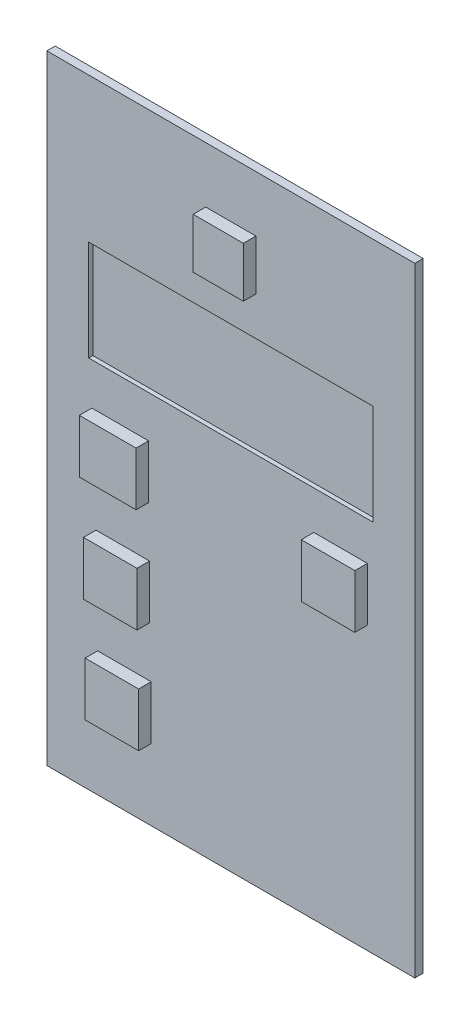
ISO-10303-21;
HEADER;
FILE_DESCRIPTION(('STEP AP214'),'2;1');
FILE_NAME('part.step','',(''),(''),'','','');
FILE_SCHEMA(('AUTOMOTIVE_DESIGN { 1 0 10303 214 1 1 1 1 }'));
ENDSEC;
DATA;
#1=APPLICATION_CONTEXT('core data for automotive mechanical design processes');
#2=APPLICATION_PROTOCOL_DEFINITION('international standard','automotive_design',2000,#1);
#3=PRODUCT_CONTEXT('',#1,'mechanical');
#4=PRODUCT('Part','Part','',(#3));
#5=PRODUCT_RELATED_PRODUCT_CATEGORY('part','',(#4));
#6=PRODUCT_DEFINITION_FORMATION('','',#4);
#7=PRODUCT_DEFINITION_CONTEXT('part definition',#1,'design');
#8=PRODUCT_DEFINITION('design','',#6,#7);
#9=PRODUCT_DEFINITION_SHAPE('','',#8);
#10=(LENGTH_UNIT() NAMED_UNIT(*) SI_UNIT(.MILLI.,.METRE.));
#11=(NAMED_UNIT(*) PLANE_ANGLE_UNIT() SI_UNIT($,.RADIAN.));
#12=(NAMED_UNIT(*) SI_UNIT($,.STERADIAN.) SOLID_ANGLE_UNIT());
#13=UNCERTAINTY_MEASURE_WITH_UNIT(LENGTH_MEASURE(1.E-05),#10,'distance_accuracy_value','');
#14=(GEOMETRIC_REPRESENTATION_CONTEXT(3) GLOBAL_UNCERTAINTY_ASSIGNED_CONTEXT((#13)) GLOBAL_UNIT_ASSIGNED_CONTEXT((#10,
#11,#12)) REPRESENTATION_CONTEXT('',''));
#15=CARTESIAN_POINT('',(0.,0.,0.));
#16=DIRECTION('',(0.,0.,1.));
#17=DIRECTION('',(1.,0.,0.));
#18=AXIS2_PLACEMENT_3D('',#15,#16,#17);
#19=CARTESIAN_POINT('',(0.,0.,1.));
#20=DIRECTION('',(0.,0.,-1.));
#21=DIRECTION('',(-1.,0.,0.));
#22=AXIS2_PLACEMENT_3D('',#19,#20,#21);
#23=PLANE('',#22);
#24=DIRECTION('',(0.,-1.,0.));
#25=VECTOR('',#24,1.);
#26=CARTESIAN_POINT('',(6.07990921444725,14.9147937996406,1.));
#27=LINE('',#26,#25);
#28=CARTESIAN_POINT('',(6.07990921444725,14.9147937996406,1.));
#29=VERTEX_POINT('',#28);
#30=CARTESIAN_POINT('',(6.07990921444725,8.51479379964056,1.));
#31=VERTEX_POINT('',#30);
#32=EDGE_CURVE('E251',#29,#31,#27,.T.);
#33=ORIENTED_EDGE('',*,*,#32,.F.);
#34=DIRECTION('',(-1.,0.,0.));
#35=VECTOR('',#34,1.);
#36=CARTESIAN_POINT('',(6.07990921444725,14.9147937996406,1.));
#37=LINE('',#36,#35);
#38=CARTESIAN_POINT('',(12.4799092144472,14.9147937996406,1.));
#39=VERTEX_POINT('',#38);
#40=EDGE_CURVE('E267',#39,#29,#37,.T.);
#41=ORIENTED_EDGE('',*,*,#40,.F.);
#42=DIRECTION('',(0.,1.,0.));
#43=VECTOR('',#42,1.);
#44=CARTESIAN_POINT('',(12.4799092144472,14.9147937996406,1.));
#45=LINE('',#44,#43);
#46=CARTESIAN_POINT('',(12.4799092144472,8.51479379964056,1.));
#47=VERTEX_POINT('',#46);
#48=EDGE_CURVE('E280',#47,#39,#45,.T.);
#49=ORIENTED_EDGE('',*,*,#48,.F.);
#50=DIRECTION('',(1.,0.,0.));
#51=VECTOR('',#50,1.);
#52=CARTESIAN_POINT('',(6.07990921444725,8.51479379964056,1.));
#53=LINE('',#52,#51);
#54=EDGE_CURVE('E256',#31,#47,#53,.T.);
#55=ORIENTED_EDGE('',*,*,#54,.F.);
#56=EDGE_LOOP('',(#33,#41,#49,#55));
#57=FACE_BOUND('',#56,.T.);
#58=DIRECTION('',(0.,-1.,0.));
#59=VECTOR('',#58,1.);
#60=CARTESIAN_POINT('',(5.39200405704682,39.7024845469302,1.));
#61=LINE('',#60,#59);
#62=CARTESIAN_POINT('',(5.39200405704682,39.7024845469302,1.));
#63=VERTEX_POINT('',#62);
#64=CARTESIAN_POINT('',(5.39200405704682,33.3147937996406,1.));
#65=VERTEX_POINT('',#64);
#66=EDGE_CURVE('E347',#63,#65,#61,.T.);
#67=ORIENTED_EDGE('',*,*,#66,.F.);
#68=DIRECTION('',(-1.,0.,0.));
#69=VECTOR('',#68,1.);
#70=CARTESIAN_POINT('',(5.39200405704682,39.7024845469302,1.));
#71=LINE('',#70,#69);
#72=CARTESIAN_POINT('',(12.1727834657082,39.7024845469302,1.));
#73=VERTEX_POINT('',#72);
#74=EDGE_CURVE('E353',#73,#63,#71,.T.);
#75=ORIENTED_EDGE('',*,*,#74,.F.);
#76=DIRECTION('',(0.,1.,0.));
#77=VECTOR('',#76,1.);
#78=CARTESIAN_POINT('',(12.1727834657082,39.7024845469302,1.));
#79=LINE('',#78,#77);
#80=CARTESIAN_POINT('',(12.1727834657082,33.3147937996406,1.));
#81=VERTEX_POINT('',#80);
#82=EDGE_CURVE('E370',#81,#73,#79,.T.);
#83=ORIENTED_EDGE('',*,*,#82,.F.);
#84=DIRECTION('',(1.,0.,0.));
#85=VECTOR('',#84,1.);
#86=CARTESIAN_POINT('',(5.39200405704682,33.3147937996406,1.));
#87=LINE('',#86,#85);
#88=EDGE_CURVE('E366',#65,#81,#87,.T.);
#89=ORIENTED_EDGE('',*,*,#88,.F.);
#90=EDGE_LOOP('',(#67,#75,#83,#89));
#91=FACE_BOUND('',#90,.T.);
#92=DIRECTION('',(0.,-1.,0.));
#93=VECTOR('',#92,1.);
#94=CARTESIAN_POINT('',(0.,0.,1.));
#95=LINE('',#94,#93);
#96=CARTESIAN_POINT('',(0.,74.,1.));
#97=VERTEX_POINT('',#96);
#98=CARTESIAN_POINT('',(0.,0.,1.));
#99=VERTEX_POINT('',#98);
#100=EDGE_CURVE('E482',#97,#99,#95,.T.);
#101=ORIENTED_EDGE('',*,*,#100,.T.);
#102=DIRECTION('',(1.,0.,0.));
#103=VECTOR('',#102,1.);
#104=CARTESIAN_POINT('',(0.,0.,1.));
#105=LINE('',#104,#103);
#106=CARTESIAN_POINT('',(44.,0.,1.));
#107=VERTEX_POINT('',#106);
#108=EDGE_CURVE('E486',#99,#107,#105,.T.);
#109=ORIENTED_EDGE('',*,*,#108,.T.);
#110=DIRECTION('',(0.,1.,0.));
#111=VECTOR('',#110,1.);
#112=CARTESIAN_POINT('',(44.,0.,1.));
#113=LINE('',#112,#111);
#114=CARTESIAN_POINT('',(44.,74.,1.));
#115=VERTEX_POINT('',#114);
#116=EDGE_CURVE('E490',#107,#115,#113,.T.);
#117=ORIENTED_EDGE('',*,*,#116,.T.);
#118=DIRECTION('',(-1.,0.,0.));
#119=VECTOR('',#118,1.);
#120=CARTESIAN_POINT('',(0.,74.,1.));
#121=LINE('',#120,#119);
#122=EDGE_CURVE('E493',#115,#97,#121,.T.);
#123=ORIENTED_EDGE('',*,*,#122,.T.);
#124=EDGE_LOOP('',(#101,#109,#117,#123));
#125=FACE_BOUND('',#124,.T.);
#126=DIRECTION('',(1.,0.,0.));
#127=VECTOR('',#126,1.);
#128=CARTESIAN_POINT('',(5.,44.7035691512551,1.));
#129=LINE('',#128,#127);
#130=CARTESIAN_POINT('',(5.,44.7035691512551,1.));
#131=VERTEX_POINT('',#130);
#132=CARTESIAN_POINT('',(39.,44.7035691512551,1.));
#133=VERTEX_POINT('',#132);
#134=EDGE_CURVE('E458',#131,#133,#129,.T.);
#135=ORIENTED_EDGE('',*,*,#134,.F.);
#136=DIRECTION('',(0.,-1.,0.));
#137=VECTOR('',#136,1.);
#138=CARTESIAN_POINT('',(5.,56.7035691512551,1.));
#139=LINE('',#138,#137);
#140=CARTESIAN_POINT('',(5.,56.7035691512551,1.));
#141=VERTEX_POINT('',#140);
#142=EDGE_CURVE('E437',#141,#131,#139,.T.);
#143=ORIENTED_EDGE('',*,*,#142,.F.);
#144=DIRECTION('',(-1.,0.,0.));
#145=VECTOR('',#144,1.);
#146=CARTESIAN_POINT('',(5.,56.7035691512551,1.));
#147=LINE('',#146,#145);
#148=CARTESIAN_POINT('',(39.,56.7035691512551,1.));
#149=VERTEX_POINT('',#148);
#150=EDGE_CURVE('E443',#149,#141,#147,.T.);
#151=ORIENTED_EDGE('',*,*,#150,.F.);
#152=DIRECTION('',(0.,1.,0.));
#153=VECTOR('',#152,1.);
#154=CARTESIAN_POINT('',(39.,56.7035691512551,1.));
#155=LINE('',#154,#153);
#156=EDGE_CURVE('E462',#133,#149,#155,.T.);
#157=ORIENTED_EDGE('',*,*,#156,.F.);
#158=EDGE_LOOP('',(#135,#143,#151,#157));
#159=FACE_BOUND('',#158,.T.);
#160=DIRECTION('',(0.,-1.,0.));
#161=VECTOR('',#160,1.);
#162=CARTESIAN_POINT('',(19.,67.3223609223723,1.));
#163=LINE('',#162,#161);
#164=CARTESIAN_POINT('',(19.,67.3223609223723,1.));
#165=VERTEX_POINT('',#164);
#166=CARTESIAN_POINT('',(19.,61.3223609223723,1.));
#167=VERTEX_POINT('',#166);
#168=EDGE_CURVE('E392',#165,#167,#163,.T.);
#169=ORIENTED_EDGE('',*,*,#168,.F.);
#170=DIRECTION('',(-1.,0.,0.));
#171=VECTOR('',#170,1.);
#172=CARTESIAN_POINT('',(19.,67.3223609223723,1.));
#173=LINE('',#172,#171);
#174=CARTESIAN_POINT('',(25.,67.3223609223723,1.));
#175=VERTEX_POINT('',#174);
#176=EDGE_CURVE('E398',#175,#165,#173,.T.);
#177=ORIENTED_EDGE('',*,*,#176,.F.);
#178=DIRECTION('',(0.,1.,0.));
#179=VECTOR('',#178,1.);
#180=CARTESIAN_POINT('',(25.,67.3223609223723,1.));
#181=LINE('',#180,#179);
#182=CARTESIAN_POINT('',(25.,61.3223609223723,1.));
#183=VERTEX_POINT('',#182);
#184=EDGE_CURVE('E415',#183,#175,#181,.T.);
#185=ORIENTED_EDGE('',*,*,#184,.F.);
#186=DIRECTION('',(1.,0.,0.));
#187=VECTOR('',#186,1.);
#188=CARTESIAN_POINT('',(19.,61.3223609223723,1.));
#189=LINE('',#188,#187);
#190=EDGE_CURVE('E411',#167,#183,#189,.T.);
#191=ORIENTED_EDGE('',*,*,#190,.F.);
#192=EDGE_LOOP('',(#169,#177,#185,#191));
#193=FACE_BOUND('',#192,.T.);
#194=DIRECTION('',(0.,-1.,0.));
#195=VECTOR('',#194,1.);
#196=CARTESIAN_POINT('',(5.88336488376141,27.3147937996406,1.));
#197=LINE('',#196,#195);
#198=CARTESIAN_POINT('',(5.88336488376141,27.3147937996406,1.));
#199=VERTEX_POINT('',#198);
#200=CARTESIAN_POINT('',(5.88336488376141,20.9147937996406,1.));
#201=VERTEX_POINT('',#200);
#202=EDGE_CURVE('E302',#199,#201,#197,.T.);
#203=ORIENTED_EDGE('',*,*,#202,.F.);
#204=DIRECTION('',(-1.,0.,0.));
#205=VECTOR('',#204,1.);
#206=CARTESIAN_POINT('',(5.88336488376141,27.3147937996406,1.));
#207=LINE('',#206,#205);
#208=CARTESIAN_POINT('',(12.2833648837614,27.3147937996406,1.));
#209=VERTEX_POINT('',#208);
#210=EDGE_CURVE('E308',#209,#199,#207,.T.);
#211=ORIENTED_EDGE('',*,*,#210,.F.);
#212=DIRECTION('',(0.,1.,0.));
#213=VECTOR('',#212,1.);
#214=CARTESIAN_POINT('',(12.2833648837614,27.3147937996406,1.));
#215=LINE('',#214,#213);
#216=CARTESIAN_POINT('',(12.2833648837614,20.9147937996406,1.));
#217=VERTEX_POINT('',#216);
#218=EDGE_CURVE('E325',#217,#209,#215,.T.);
#219=ORIENTED_EDGE('',*,*,#218,.F.);
#220=DIRECTION('',(1.,0.,0.));
#221=VECTOR('',#220,1.);
#222=CARTESIAN_POINT('',(5.88336488376141,20.9147937996406,1.));
#223=LINE('',#222,#221);
#224=EDGE_CURVE('E321',#201,#217,#223,.T.);
#225=ORIENTED_EDGE('',*,*,#224,.F.);
#226=EDGE_LOOP('',(#203,#211,#219,#225));
#227=FACE_BOUND('',#226,.T.);
#228=DIRECTION('',(0.,1.,0.));
#229=VECTOR('',#228,1.);
#230=CARTESIAN_POINT('',(38.3254886996347,40.0955732083019,1.));
#231=LINE('',#230,#229);
#232=CARTESIAN_POINT('',(38.3254886996347,33.6955732083019,1.));
#233=VERTEX_POINT('',#232);
#234=CARTESIAN_POINT('',(38.3254886996347,40.0955732083019,1.));
#235=VERTEX_POINT('',#234);
#236=EDGE_CURVE('E249',#233,#235,#231,.T.);
#237=ORIENTED_EDGE('',*,*,#236,.F.);
#238=DIRECTION('',(1.,0.,0.));
#239=VECTOR('',#238,1.);
#240=CARTESIAN_POINT('',(38.3254886996347,33.6955732083019,1.));
#241=LINE('',#240,#239);
#242=CARTESIAN_POINT('',(31.9254886996347,33.6955732083019,1.));
#243=VERTEX_POINT('',#242);
#244=EDGE_CURVE('E246',#243,#233,#241,.T.);
#245=ORIENTED_EDGE('',*,*,#244,.F.);
#246=DIRECTION('',(0.,-1.,0.));
#247=VECTOR('',#246,1.);
#248=CARTESIAN_POINT('',(31.9254886996347,40.0955732083019,1.));
#249=LINE('',#248,#247);
#250=CARTESIAN_POINT('',(31.9254886996347,40.0955732083019,1.));
#251=VERTEX_POINT('',#250);
#252=EDGE_CURVE('E62',#251,#243,#249,.T.);
#253=ORIENTED_EDGE('',*,*,#252,.F.);
#254=DIRECTION('',(-1.,0.,0.));
#255=VECTOR('',#254,1.);
#256=CARTESIAN_POINT('',(38.3254886996347,40.0955732083019,1.));
#257=LINE('',#256,#255);
#258=EDGE_CURVE('E57',#235,#251,#257,.T.);
#259=ORIENTED_EDGE('',*,*,#258,.F.);
#260=EDGE_LOOP('',(#237,#245,#253,#259));
#261=FACE_BOUND('',#260,.T.);
#262=ADVANCED_FACE('F41',(#57,#91,#125,#159,#193,#227,#261),#23,.F.);
#263=CARTESIAN_POINT('',(0.,0.,1.));
#264=DIRECTION('',(1.,0.,0.));
#265=DIRECTION('',(0.,0.,-1.));
#266=AXIS2_PLACEMENT_3D('',#263,#264,#265);
#267=PLANE('',#266);
#268=DIRECTION('',(0.,-1.,0.));
#269=VECTOR('',#268,1.);
#270=CARTESIAN_POINT('',(0.,0.,0.));
#271=LINE('',#270,#269);
#272=CARTESIAN_POINT('',(0.,74.,0.));
#273=VERTEX_POINT('',#272);
#274=CARTESIAN_POINT('',(0.,0.,0.));
#275=VERTEX_POINT('',#274);
#276=EDGE_CURVE('E472',#273,#275,#271,.T.);
#277=ORIENTED_EDGE('',*,*,#276,.T.);
#278=DIRECTION('',(0.,0.,-1.));
#279=VECTOR('',#278,1.);
#280=CARTESIAN_POINT('',(0.,0.,1.));
#281=LINE('',#280,#279);
#282=EDGE_CURVE('E11',#99,#275,#281,.T.);
#283=ORIENTED_EDGE('',*,*,#282,.F.);
#284=ORIENTED_EDGE('',*,*,#100,.F.);
#285=DIRECTION('',(0.,0.,-1.));
#286=VECTOR('',#285,1.);
#287=CARTESIAN_POINT('',(0.,74.,1.));
#288=LINE('',#287,#286);
#289=EDGE_CURVE('E496',#97,#273,#288,.T.);
#290=ORIENTED_EDGE('',*,*,#289,.T.);
#291=EDGE_LOOP('',(#277,#283,#284,#290));
#292=FACE_BOUND('',#291,.T.);
#293=ADVANCED_FACE('F43',(#292),#267,.F.);
#294=CARTESIAN_POINT('',(0.,0.,1.));
#295=DIRECTION('',(0.,1.,0.));
#296=DIRECTION('',(0.,0.,1.));
#297=AXIS2_PLACEMENT_3D('',#294,#295,#296);
#298=PLANE('',#297);
#299=DIRECTION('',(1.,0.,0.));
#300=VECTOR('',#299,1.);
#301=CARTESIAN_POINT('',(0.,0.,0.));
#302=LINE('',#301,#300);
#303=CARTESIAN_POINT('',(44.,0.,0.));
#304=VERTEX_POINT('',#303);
#305=EDGE_CURVE('E500',#275,#304,#302,.T.);
#306=ORIENTED_EDGE('',*,*,#305,.T.);
#307=DIRECTION('',(0.,0.,-1.));
#308=VECTOR('',#307,1.);
#309=CARTESIAN_POINT('',(44.,0.,1.));
#310=LINE('',#309,#308);
#311=EDGE_CURVE('E50',#107,#304,#310,.T.);
#312=ORIENTED_EDGE('',*,*,#311,.F.);
#313=ORIENTED_EDGE('',*,*,#108,.F.);
#314=ORIENTED_EDGE('',*,*,#282,.T.);
#315=EDGE_LOOP('',(#306,#312,#313,#314));
#316=FACE_BOUND('',#315,.T.);
#317=ADVANCED_FACE('F536',(#316),#298,.F.);
#318=CARTESIAN_POINT('',(44.,0.,1.));
#319=DIRECTION('',(-1.,0.,0.));
#320=DIRECTION('',(0.,-1.,0.));
#321=AXIS2_PLACEMENT_3D('',#318,#319,#320);
#322=PLANE('',#321);
#323=DIRECTION('',(0.,1.,0.));
#324=VECTOR('',#323,1.);
#325=CARTESIAN_POINT('',(44.,0.,0.));
#326=LINE('',#325,#324);
#327=CARTESIAN_POINT('',(44.,74.,0.));
#328=VERTEX_POINT('',#327);
#329=EDGE_CURVE('E503',#304,#328,#326,.T.);
#330=ORIENTED_EDGE('',*,*,#329,.T.);
#331=DIRECTION('',(0.,0.,-1.));
#332=VECTOR('',#331,1.);
#333=CARTESIAN_POINT('',(44.,74.,1.));
#334=LINE('',#333,#332);
#335=EDGE_CURVE('E511',#115,#328,#334,.T.);
#336=ORIENTED_EDGE('',*,*,#335,.F.);
#337=ORIENTED_EDGE('',*,*,#116,.F.);
#338=ORIENTED_EDGE('',*,*,#311,.T.);
#339=EDGE_LOOP('',(#330,#336,#337,#338));
#340=FACE_BOUND('',#339,.T.);
#341=ADVANCED_FACE('F520',(#340),#322,.F.);
#342=CARTESIAN_POINT('',(0.,74.,1.));
#343=DIRECTION('',(0.,-1.,0.));
#344=DIRECTION('',(0.,0.,-1.));
#345=AXIS2_PLACEMENT_3D('',#342,#343,#344);
#346=PLANE('',#345);
#347=DIRECTION('',(-1.,0.,0.));
#348=VECTOR('',#347,1.);
#349=CARTESIAN_POINT('',(0.,74.,0.));
#350=LINE('',#349,#348);
#351=EDGE_CURVE('E487',#328,#273,#350,.T.);
#352=ORIENTED_EDGE('',*,*,#351,.T.);
#353=ORIENTED_EDGE('',*,*,#289,.F.);
#354=ORIENTED_EDGE('',*,*,#122,.F.);
#355=ORIENTED_EDGE('',*,*,#335,.T.);
#356=EDGE_LOOP('',(#352,#353,#354,#355));
#357=FACE_BOUND('',#356,.T.);
#358=ADVANCED_FACE('F529',(#357),#346,.F.);
#359=CARTESIAN_POINT('',(0.,0.,0.));
#360=DIRECTION('',(0.,0.,-1.));
#361=DIRECTION('',(-1.,0.,0.));
#362=AXIS2_PLACEMENT_3D('',#359,#360,#361);
#363=PLANE('',#362);
#364=ORIENTED_EDGE('',*,*,#276,.F.);
#365=ORIENTED_EDGE('',*,*,#351,.F.);
#366=ORIENTED_EDGE('',*,*,#329,.F.);
#367=ORIENTED_EDGE('',*,*,#305,.F.);
#368=EDGE_LOOP('',(#364,#365,#366,#367));
#369=FACE_BOUND('',#368,.T.);
#370=ADVANCED_FACE('F526',(#369),#363,.T.);
#371=CARTESIAN_POINT('',(5.,56.7035691512551,0.5));
#372=DIRECTION('',(-1.,0.,0.));
#373=DIRECTION('',(0.,-1.,0.));
#374=AXIS2_PLACEMENT_3D('',#371,#372,#373);
#375=PLANE('',#374);
#376=ORIENTED_EDGE('',*,*,#142,.T.);
#377=DIRECTION('',(0.,0.,1.));
#378=VECTOR('',#377,1.);
#379=CARTESIAN_POINT('',(5.,44.7035691512551,0.5));
#380=LINE('',#379,#378);
#381=CARTESIAN_POINT('',(5.,44.7035691512551,0.5));
#382=VERTEX_POINT('',#381);
#383=EDGE_CURVE('E455',#382,#131,#380,.T.);
#384=ORIENTED_EDGE('',*,*,#383,.F.);
#385=DIRECTION('',(0.,-1.,0.));
#386=VECTOR('',#385,1.);
#387=CARTESIAN_POINT('',(5.,56.7035691512551,0.5));
#388=LINE('',#387,#386);
#389=CARTESIAN_POINT('',(5.,56.7035691512551,0.5));
#390=VERTEX_POINT('',#389);
#391=EDGE_CURVE('E438',#390,#382,#388,.T.);
#392=ORIENTED_EDGE('',*,*,#391,.F.);
#393=DIRECTION('',(0.,0.,1.));
#394=VECTOR('',#393,1.);
#395=CARTESIAN_POINT('',(5.,56.7035691512551,0.5));
#396=LINE('',#395,#394);
#397=EDGE_CURVE('E469',#390,#141,#396,.T.);
#398=ORIENTED_EDGE('',*,*,#397,.T.);
#399=EDGE_LOOP('',(#376,#384,#392,#398));
#400=FACE_BOUND('',#399,.T.);
#401=ADVANCED_FACE('F551',(#400),#375,.F.);
#402=CARTESIAN_POINT('',(5.,56.7035691512551,0.5));
#403=DIRECTION('',(0.,1.,0.));
#404=DIRECTION('',(-1.,0.,0.));
#405=AXIS2_PLACEMENT_3D('',#402,#403,#404);
#406=PLANE('',#405);
#407=ORIENTED_EDGE('',*,*,#150,.T.);
#408=ORIENTED_EDGE('',*,*,#397,.F.);
#409=DIRECTION('',(-1.,0.,0.));
#410=VECTOR('',#409,1.);
#411=CARTESIAN_POINT('',(5.,56.7035691512551,0.5));
#412=LINE('',#411,#410);
#413=CARTESIAN_POINT('',(39.,56.7035691512551,0.5));
#414=VERTEX_POINT('',#413);
#415=EDGE_CURVE('E451',#414,#390,#412,.T.);
#416=ORIENTED_EDGE('',*,*,#415,.F.);
#417=DIRECTION('',(0.,0.,1.));
#418=VECTOR('',#417,1.);
#419=CARTESIAN_POINT('',(39.,56.7035691512551,0.5));
#420=LINE('',#419,#418);
#421=EDGE_CURVE('E473',#414,#149,#420,.T.);
#422=ORIENTED_EDGE('',*,*,#421,.T.);
#423=EDGE_LOOP('',(#407,#408,#416,#422));
#424=FACE_BOUND('',#423,.T.);
#425=ADVANCED_FACE('F570',(#424),#406,.F.);
#426=CARTESIAN_POINT('',(39.,56.7035691512551,0.5));
#427=DIRECTION('',(1.,0.,0.));
#428=DIRECTION('',(0.,0.,-1.));
#429=AXIS2_PLACEMENT_3D('',#426,#427,#428);
#430=PLANE('',#429);
#431=ORIENTED_EDGE('',*,*,#156,.T.);
#432=ORIENTED_EDGE('',*,*,#421,.F.);
#433=DIRECTION('',(0.,1.,0.));
#434=VECTOR('',#433,1.);
#435=CARTESIAN_POINT('',(39.,56.7035691512551,0.5));
#436=LINE('',#435,#434);
#437=CARTESIAN_POINT('',(39.,44.7035691512551,0.5));
#438=VERTEX_POINT('',#437);
#439=EDGE_CURVE('E447',#438,#414,#436,.T.);
#440=ORIENTED_EDGE('',*,*,#439,.F.);
#441=DIRECTION('',(0.,0.,1.));
#442=VECTOR('',#441,1.);
#443=CARTESIAN_POINT('',(39.,44.7035691512551,0.5));
#444=LINE('',#443,#442);
#445=EDGE_CURVE('E476',#438,#133,#444,.T.);
#446=ORIENTED_EDGE('',*,*,#445,.T.);
#447=EDGE_LOOP('',(#431,#432,#440,#446));
#448=FACE_BOUND('',#447,.T.);
#449=ADVANCED_FACE('F577',(#448),#430,.F.);
#450=CARTESIAN_POINT('',(5.,44.7035691512551,0.5));
#451=DIRECTION('',(0.,-1.,0.));
#452=DIRECTION('',(0.,0.,-1.));
#453=AXIS2_PLACEMENT_3D('',#450,#451,#452);
#454=PLANE('',#453);
#455=ORIENTED_EDGE('',*,*,#134,.T.);
#456=ORIENTED_EDGE('',*,*,#445,.F.);
#457=DIRECTION('',(1.,0.,0.));
#458=VECTOR('',#457,1.);
#459=CARTESIAN_POINT('',(5.,44.7035691512551,0.5));
#460=LINE('',#459,#458);
#461=EDGE_CURVE('E442',#382,#438,#460,.T.);
#462=ORIENTED_EDGE('',*,*,#461,.F.);
#463=ORIENTED_EDGE('',*,*,#383,.T.);
#464=EDGE_LOOP('',(#455,#456,#462,#463));
#465=FACE_BOUND('',#464,.T.);
#466=ADVANCED_FACE('F585',(#465),#454,.F.);
#467=CARTESIAN_POINT('',(0.,0.,0.5));
#468=DIRECTION('',(0.,0.,1.));
#469=DIRECTION('',(1.,0.,0.));
#470=AXIS2_PLACEMENT_3D('',#467,#468,#469);
#471=PLANE('',#470);
#472=ORIENTED_EDGE('',*,*,#391,.T.);
#473=ORIENTED_EDGE('',*,*,#461,.T.);
#474=ORIENTED_EDGE('',*,*,#439,.T.);
#475=ORIENTED_EDGE('',*,*,#415,.T.);
#476=EDGE_LOOP('',(#472,#473,#474,#475));
#477=FACE_BOUND('',#476,.T.);
#478=ADVANCED_FACE('F593',(#477),#471,.T.);
#479=CARTESIAN_POINT('',(19.,67.3223609223723,2.5));
#480=DIRECTION('',(1.,0.,0.));
#481=DIRECTION('',(0.,1.,0.));
#482=AXIS2_PLACEMENT_3D('',#479,#480,#481);
#483=PLANE('',#482);
#484=ORIENTED_EDGE('',*,*,#168,.T.);
#485=DIRECTION('',(0.,0.,-1.));
#486=VECTOR('',#485,1.);
#487=CARTESIAN_POINT('',(19.,61.3223609223723,2.5));
#488=LINE('',#487,#486);
#489=CARTESIAN_POINT('',(19.,61.3223609223723,2.5));
#490=VERTEX_POINT('',#489);
#491=EDGE_CURVE('E433',#490,#167,#488,.T.);
#492=ORIENTED_EDGE('',*,*,#491,.F.);
#493=DIRECTION('',(0.,-1.,0.));
#494=VECTOR('',#493,1.);
#495=CARTESIAN_POINT('',(19.,67.3223609223723,2.5));
#496=LINE('',#495,#494);
#497=CARTESIAN_POINT('',(19.,67.3223609223723,2.5));
#498=VERTEX_POINT('',#497);
#499=EDGE_CURVE('E393',#498,#490,#496,.T.);
#500=ORIENTED_EDGE('',*,*,#499,.F.);
#501=DIRECTION('',(0.,0.,-1.));
#502=VECTOR('',#501,1.);
#503=CARTESIAN_POINT('',(19.,67.3223609223723,2.5));
#504=LINE('',#503,#502);
#505=EDGE_CURVE('E407',#498,#165,#504,.T.);
#506=ORIENTED_EDGE('',*,*,#505,.T.);
#507=EDGE_LOOP('',(#484,#492,#500,#506));
#508=FACE_BOUND('',#507,.T.);
#509=ADVANCED_FACE('F601',(#508),#483,.F.);
#510=CARTESIAN_POINT('',(19.,61.3223609223723,2.5));
#511=DIRECTION('',(0.,1.,0.));
#512=DIRECTION('',(0.,0.,1.));
#513=AXIS2_PLACEMENT_3D('',#510,#511,#512);
#514=PLANE('',#513);
#515=ORIENTED_EDGE('',*,*,#190,.T.);
#516=DIRECTION('',(0.,0.,-1.));
#517=VECTOR('',#516,1.);
#518=CARTESIAN_POINT('',(25.,61.3223609223723,2.5));
#519=LINE('',#518,#517);
#520=CARTESIAN_POINT('',(25.,61.3223609223723,2.5));
#521=VERTEX_POINT('',#520);
#522=EDGE_CURVE('E429',#521,#183,#519,.T.);
#523=ORIENTED_EDGE('',*,*,#522,.F.);
#524=DIRECTION('',(1.,0.,0.));
#525=VECTOR('',#524,1.);
#526=CARTESIAN_POINT('',(19.,61.3223609223723,2.5));
#527=LINE('',#526,#525);
#528=EDGE_CURVE('E397',#490,#521,#527,.T.);
#529=ORIENTED_EDGE('',*,*,#528,.F.);
#530=ORIENTED_EDGE('',*,*,#491,.T.);
#531=EDGE_LOOP('',(#515,#523,#529,#530));
#532=FACE_BOUND('',#531,.T.);
#533=ADVANCED_FACE('F609',(#532),#514,.F.);
#534=CARTESIAN_POINT('',(25.,67.3223609223723,2.5));
#535=DIRECTION('',(-1.,0.,0.));
#536=DIRECTION('',(0.,0.,1.));
#537=AXIS2_PLACEMENT_3D('',#534,#535,#536);
#538=PLANE('',#537);
#539=ORIENTED_EDGE('',*,*,#184,.T.);
#540=DIRECTION('',(0.,0.,-1.));
#541=VECTOR('',#540,1.);
#542=CARTESIAN_POINT('',(25.,67.3223609223723,2.5));
#543=LINE('',#542,#541);
#544=CARTESIAN_POINT('',(25.,67.3223609223723,2.5));
#545=VERTEX_POINT('',#544);
#546=EDGE_CURVE('E425',#545,#175,#543,.T.);
#547=ORIENTED_EDGE('',*,*,#546,.F.);
#548=DIRECTION('',(0.,1.,0.));
#549=VECTOR('',#548,1.);
#550=CARTESIAN_POINT('',(25.,67.3223609223723,2.5));
#551=LINE('',#550,#549);
#552=EDGE_CURVE('E401',#521,#545,#551,.T.);
#553=ORIENTED_EDGE('',*,*,#552,.F.);
#554=ORIENTED_EDGE('',*,*,#522,.T.);
#555=EDGE_LOOP('',(#539,#547,#553,#554));
#556=FACE_BOUND('',#555,.T.);
#557=ADVANCED_FACE('F617',(#556),#538,.F.);
#558=CARTESIAN_POINT('',(19.,67.3223609223723,2.5));
#559=DIRECTION('',(0.,-1.,0.));
#560=DIRECTION('',(0.,0.,-1.));
#561=AXIS2_PLACEMENT_3D('',#558,#559,#560);
#562=PLANE('',#561);
#563=ORIENTED_EDGE('',*,*,#176,.T.);
#564=ORIENTED_EDGE('',*,*,#505,.F.);
#565=DIRECTION('',(-1.,0.,0.));
#566=VECTOR('',#565,1.);
#567=CARTESIAN_POINT('',(19.,67.3223609223723,2.5));
#568=LINE('',#567,#566);
#569=EDGE_CURVE('E404',#545,#498,#568,.T.);
#570=ORIENTED_EDGE('',*,*,#569,.F.);
#571=ORIENTED_EDGE('',*,*,#546,.T.);
#572=EDGE_LOOP('',(#563,#564,#570,#571));
#573=FACE_BOUND('',#572,.T.);
#574=ADVANCED_FACE('F625',(#573),#562,.F.);
#575=CARTESIAN_POINT('',(0.,0.,2.5));
#576=DIRECTION('',(0.,0.,1.));
#577=DIRECTION('',(1.,0.,0.));
#578=AXIS2_PLACEMENT_3D('',#575,#576,#577);
#579=PLANE('',#578);
#580=ORIENTED_EDGE('',*,*,#499,.T.);
#581=ORIENTED_EDGE('',*,*,#528,.T.);
#582=ORIENTED_EDGE('',*,*,#552,.T.);
#583=ORIENTED_EDGE('',*,*,#569,.T.);
#584=EDGE_LOOP('',(#580,#581,#582,#583));
#585=FACE_BOUND('',#584,.T.);
#586=ADVANCED_FACE('F633',(#585),#579,.T.);
#587=CARTESIAN_POINT('',(5.39200405704682,39.7024845469302,2.5));
#588=DIRECTION('',(1.,0.,0.));
#589=DIRECTION('',(0.,0.,-1.));
#590=AXIS2_PLACEMENT_3D('',#587,#588,#589);
#591=PLANE('',#590);
#592=ORIENTED_EDGE('',*,*,#66,.T.);
#593=DIRECTION('',(0.,0.,-1.));
#594=VECTOR('',#593,1.);
#595=CARTESIAN_POINT('',(5.39200405704682,33.3147937996406,2.5));
#596=LINE('',#595,#594);
#597=CARTESIAN_POINT('',(5.39200405704682,33.3147937996406,2.5));
#598=VERTEX_POINT('',#597);
#599=EDGE_CURVE('E388',#598,#65,#596,.T.);
#600=ORIENTED_EDGE('',*,*,#599,.F.);
#601=DIRECTION('',(0.,-1.,0.));
#602=VECTOR('',#601,1.);
#603=CARTESIAN_POINT('',(5.39200405704682,39.7024845469302,2.5));
#604=LINE('',#603,#602);
#605=CARTESIAN_POINT('',(5.39200405704682,39.7024845469302,2.5));
#606=VERTEX_POINT('',#605);
#607=EDGE_CURVE('E348',#606,#598,#604,.T.);
#608=ORIENTED_EDGE('',*,*,#607,.F.);
#609=DIRECTION('',(0.,0.,-1.));
#610=VECTOR('',#609,1.);
#611=CARTESIAN_POINT('',(5.39200405704682,39.7024845469302,2.5));
#612=LINE('',#611,#610);
#613=EDGE_CURVE('E362',#606,#63,#612,.T.);
#614=ORIENTED_EDGE('',*,*,#613,.T.);
#615=EDGE_LOOP('',(#592,#600,#608,#614));
#616=FACE_BOUND('',#615,.T.);
#617=ADVANCED_FACE('F641',(#616),#591,.F.);
#618=CARTESIAN_POINT('',(5.39200405704682,33.3147937996406,2.5));
#619=DIRECTION('',(0.,1.,0.));
#620=DIRECTION('',(0.,0.,1.));
#621=AXIS2_PLACEMENT_3D('',#618,#619,#620);
#622=PLANE('',#621);
#623=ORIENTED_EDGE('',*,*,#88,.T.);
#624=DIRECTION('',(0.,0.,-1.));
#625=VECTOR('',#624,1.);
#626=CARTESIAN_POINT('',(12.1727834657082,33.3147937996406,2.5));
#627=LINE('',#626,#625);
#628=CARTESIAN_POINT('',(12.1727834657082,33.3147937996406,2.5));
#629=VERTEX_POINT('',#628);
#630=EDGE_CURVE('E384',#629,#81,#627,.T.);
#631=ORIENTED_EDGE('',*,*,#630,.F.);
#632=DIRECTION('',(1.,0.,0.));
#633=VECTOR('',#632,1.);
#634=CARTESIAN_POINT('',(5.39200405704682,33.3147937996406,2.5));
#635=LINE('',#634,#633);
#636=EDGE_CURVE('E352',#598,#629,#635,.T.);
#637=ORIENTED_EDGE('',*,*,#636,.F.);
#638=ORIENTED_EDGE('',*,*,#599,.T.);
#639=EDGE_LOOP('',(#623,#631,#637,#638));
#640=FACE_BOUND('',#639,.T.);
#641=ADVANCED_FACE('F649',(#640),#622,.F.);
#642=CARTESIAN_POINT('',(12.1727834657082,39.7024845469302,2.5));
#643=DIRECTION('',(-1.,0.,0.));
#644=DIRECTION('',(0.,0.,1.));
#645=AXIS2_PLACEMENT_3D('',#642,#643,#644);
#646=PLANE('',#645);
#647=ORIENTED_EDGE('',*,*,#82,.T.);
#648=DIRECTION('',(0.,0.,-1.));
#649=VECTOR('',#648,1.);
#650=CARTESIAN_POINT('',(12.1727834657082,39.7024845469302,2.5));
#651=LINE('',#650,#649);
#652=CARTESIAN_POINT('',(12.1727834657082,39.7024845469302,2.5));
#653=VERTEX_POINT('',#652);
#654=EDGE_CURVE('E380',#653,#73,#651,.T.);
#655=ORIENTED_EDGE('',*,*,#654,.F.);
#656=DIRECTION('',(0.,1.,0.));
#657=VECTOR('',#656,1.);
#658=CARTESIAN_POINT('',(12.1727834657082,39.7024845469302,2.5));
#659=LINE('',#658,#657);
#660=EDGE_CURVE('E356',#629,#653,#659,.T.);
#661=ORIENTED_EDGE('',*,*,#660,.F.);
#662=ORIENTED_EDGE('',*,*,#630,.T.);
#663=EDGE_LOOP('',(#647,#655,#661,#662));
#664=FACE_BOUND('',#663,.T.);
#665=ADVANCED_FACE('F657',(#664),#646,.F.);
#666=CARTESIAN_POINT('',(5.39200405704682,39.7024845469302,2.5));
#667=DIRECTION('',(0.,-1.,0.));
#668=DIRECTION('',(0.,0.,-1.));
#669=AXIS2_PLACEMENT_3D('',#666,#667,#668);
#670=PLANE('',#669);
#671=ORIENTED_EDGE('',*,*,#74,.T.);
#672=ORIENTED_EDGE('',*,*,#613,.F.);
#673=DIRECTION('',(-1.,0.,0.));
#674=VECTOR('',#673,1.);
#675=CARTESIAN_POINT('',(5.39200405704682,39.7024845469302,2.5));
#676=LINE('',#675,#674);
#677=EDGE_CURVE('E359',#653,#606,#676,.T.);
#678=ORIENTED_EDGE('',*,*,#677,.F.);
#679=ORIENTED_EDGE('',*,*,#654,.T.);
#680=EDGE_LOOP('',(#671,#672,#678,#679));
#681=FACE_BOUND('',#680,.T.);
#682=ADVANCED_FACE('F665',(#681),#670,.F.);
#683=CARTESIAN_POINT('',(0.,0.,2.5));
#684=DIRECTION('',(0.,0.,1.));
#685=DIRECTION('',(1.,0.,0.));
#686=AXIS2_PLACEMENT_3D('',#683,#684,#685);
#687=PLANE('',#686);
#688=ORIENTED_EDGE('',*,*,#607,.T.);
#689=ORIENTED_EDGE('',*,*,#636,.T.);
#690=ORIENTED_EDGE('',*,*,#660,.T.);
#691=ORIENTED_EDGE('',*,*,#677,.T.);
#692=EDGE_LOOP('',(#688,#689,#690,#691));
#693=FACE_BOUND('',#692,.T.);
#694=ADVANCED_FACE('F673',(#693),#687,.T.);
#695=CARTESIAN_POINT('',(5.88336488376141,27.3147937996406,2.5));
#696=DIRECTION('',(1.,0.,0.));
#697=DIRECTION('',(0.,1.,0.));
#698=AXIS2_PLACEMENT_3D('',#695,#696,#697);
#699=PLANE('',#698);
#700=ORIENTED_EDGE('',*,*,#202,.T.);
#701=DIRECTION('',(0.,0.,-1.));
#702=VECTOR('',#701,1.);
#703=CARTESIAN_POINT('',(5.88336488376141,20.9147937996406,2.5));
#704=LINE('',#703,#702);
#705=CARTESIAN_POINT('',(5.88336488376141,20.9147937996406,2.5));
#706=VERTEX_POINT('',#705);
#707=EDGE_CURVE('E343',#706,#201,#704,.T.);
#708=ORIENTED_EDGE('',*,*,#707,.F.);
#709=DIRECTION('',(0.,-1.,0.));
#710=VECTOR('',#709,1.);
#711=CARTESIAN_POINT('',(5.88336488376141,27.3147937996406,2.5));
#712=LINE('',#711,#710);
#713=CARTESIAN_POINT('',(5.88336488376141,27.3147937996406,2.5));
#714=VERTEX_POINT('',#713);
#715=EDGE_CURVE('E303',#714,#706,#712,.T.);
#716=ORIENTED_EDGE('',*,*,#715,.F.);
#717=DIRECTION('',(0.,0.,-1.));
#718=VECTOR('',#717,1.);
#719=CARTESIAN_POINT('',(5.88336488376141,27.3147937996406,2.5));
#720=LINE('',#719,#718);
#721=EDGE_CURVE('E317',#714,#199,#720,.T.);
#722=ORIENTED_EDGE('',*,*,#721,.T.);
#723=EDGE_LOOP('',(#700,#708,#716,#722));
#724=FACE_BOUND('',#723,.T.);
#725=ADVANCED_FACE('F681',(#724),#699,.F.);
#726=CARTESIAN_POINT('',(5.88336488376141,20.9147937996406,2.5));
#727=DIRECTION('',(0.,1.,0.));
#728=DIRECTION('',(0.,0.,1.));
#729=AXIS2_PLACEMENT_3D('',#726,#727,#728);
#730=PLANE('',#729);
#731=ORIENTED_EDGE('',*,*,#224,.T.);
#732=DIRECTION('',(0.,0.,-1.));
#733=VECTOR('',#732,1.);
#734=CARTESIAN_POINT('',(12.2833648837614,20.9147937996406,2.5));
#735=LINE('',#734,#733);
#736=CARTESIAN_POINT('',(12.2833648837614,20.9147937996406,2.5));
#737=VERTEX_POINT('',#736);
#738=EDGE_CURVE('E339',#737,#217,#735,.T.);
#739=ORIENTED_EDGE('',*,*,#738,.F.);
#740=DIRECTION('',(1.,0.,0.));
#741=VECTOR('',#740,1.);
#742=CARTESIAN_POINT('',(5.88336488376141,20.9147937996406,2.5));
#743=LINE('',#742,#741);
#744=EDGE_CURVE('E307',#706,#737,#743,.T.);
#745=ORIENTED_EDGE('',*,*,#744,.F.);
#746=ORIENTED_EDGE('',*,*,#707,.T.);
#747=EDGE_LOOP('',(#731,#739,#745,#746));
#748=FACE_BOUND('',#747,.T.);
#749=ADVANCED_FACE('F689',(#748),#730,.F.);
#750=CARTESIAN_POINT('',(12.2833648837614,27.3147937996406,2.5));
#751=DIRECTION('',(-1.,0.,0.));
#752=DIRECTION('',(0.,0.,1.));
#753=AXIS2_PLACEMENT_3D('',#750,#751,#752);
#754=PLANE('',#753);
#755=ORIENTED_EDGE('',*,*,#218,.T.);
#756=DIRECTION('',(0.,0.,-1.));
#757=VECTOR('',#756,1.);
#758=CARTESIAN_POINT('',(12.2833648837614,27.3147937996406,2.5));
#759=LINE('',#758,#757);
#760=CARTESIAN_POINT('',(12.2833648837614,27.3147937996406,2.5));
#761=VERTEX_POINT('',#760);
#762=EDGE_CURVE('E335',#761,#209,#759,.T.);
#763=ORIENTED_EDGE('',*,*,#762,.F.);
#764=DIRECTION('',(0.,1.,0.));
#765=VECTOR('',#764,1.);
#766=CARTESIAN_POINT('',(12.2833648837614,27.3147937996406,2.5));
#767=LINE('',#766,#765);
#768=EDGE_CURVE('E311',#737,#761,#767,.T.);
#769=ORIENTED_EDGE('',*,*,#768,.F.);
#770=ORIENTED_EDGE('',*,*,#738,.T.);
#771=EDGE_LOOP('',(#755,#763,#769,#770));
#772=FACE_BOUND('',#771,.T.);
#773=ADVANCED_FACE('F697',(#772),#754,.F.);
#774=CARTESIAN_POINT('',(5.88336488376141,27.3147937996406,2.5));
#775=DIRECTION('',(0.,-1.,0.));
#776=DIRECTION('',(0.,0.,-1.));
#777=AXIS2_PLACEMENT_3D('',#774,#775,#776);
#778=PLANE('',#777);
#779=ORIENTED_EDGE('',*,*,#210,.T.);
#780=ORIENTED_EDGE('',*,*,#721,.F.);
#781=DIRECTION('',(-1.,0.,0.));
#782=VECTOR('',#781,1.);
#783=CARTESIAN_POINT('',(5.88336488376141,27.3147937996406,2.5));
#784=LINE('',#783,#782);
#785=EDGE_CURVE('E314',#761,#714,#784,.T.);
#786=ORIENTED_EDGE('',*,*,#785,.F.);
#787=ORIENTED_EDGE('',*,*,#762,.T.);
#788=EDGE_LOOP('',(#779,#780,#786,#787));
#789=FACE_BOUND('',#788,.T.);
#790=ADVANCED_FACE('F705',(#789),#778,.F.);
#791=CARTESIAN_POINT('',(0.,0.,2.5));
#792=DIRECTION('',(0.,0.,1.));
#793=DIRECTION('',(1.,0.,0.));
#794=AXIS2_PLACEMENT_3D('',#791,#792,#793);
#795=PLANE('',#794);
#796=ORIENTED_EDGE('',*,*,#715,.T.);
#797=ORIENTED_EDGE('',*,*,#744,.T.);
#798=ORIENTED_EDGE('',*,*,#768,.T.);
#799=ORIENTED_EDGE('',*,*,#785,.T.);
#800=EDGE_LOOP('',(#796,#797,#798,#799));
#801=FACE_BOUND('',#800,.T.);
#802=ADVANCED_FACE('F713',(#801),#795,.T.);
#803=CARTESIAN_POINT('',(6.07990921444725,14.9147937996406,2.5));
#804=DIRECTION('',(1.,0.,0.));
#805=DIRECTION('',(0.,1.,0.));
#806=AXIS2_PLACEMENT_3D('',#803,#804,#805);
#807=PLANE('',#806);
#808=ORIENTED_EDGE('',*,*,#32,.T.);
#809=DIRECTION('',(0.,0.,-1.));
#810=VECTOR('',#809,1.);
#811=CARTESIAN_POINT('',(6.07990921444725,8.51479379964056,2.5));
#812=LINE('',#811,#810);
#813=CARTESIAN_POINT('',(6.07990921444725,8.51479379964056,2.5));
#814=VERTEX_POINT('',#813);
#815=EDGE_CURVE('E298',#814,#31,#812,.T.);
#816=ORIENTED_EDGE('',*,*,#815,.F.);
#817=DIRECTION('',(0.,-1.,0.));
#818=VECTOR('',#817,1.);
#819=CARTESIAN_POINT('',(6.07990921444725,14.9147937996406,2.5));
#820=LINE('',#819,#818);
#821=CARTESIAN_POINT('',(6.07990921444725,14.9147937996406,2.5));
#822=VERTEX_POINT('',#821);
#823=EDGE_CURVE('E262',#822,#814,#820,.T.);
#824=ORIENTED_EDGE('',*,*,#823,.F.);
#825=DIRECTION('',(0.,0.,-1.));
#826=VECTOR('',#825,1.);
#827=CARTESIAN_POINT('',(6.07990921444725,14.9147937996406,2.5));
#828=LINE('',#827,#826);
#829=EDGE_CURVE('E275',#822,#29,#828,.T.);
#830=ORIENTED_EDGE('',*,*,#829,.T.);
#831=EDGE_LOOP('',(#808,#816,#824,#830));
#832=FACE_BOUND('',#831,.T.);
#833=ADVANCED_FACE('F721',(#832),#807,.F.);
#834=CARTESIAN_POINT('',(6.07990921444725,8.51479379964056,2.5));
#835=DIRECTION('',(0.,1.,0.));
#836=DIRECTION('',(0.,0.,1.));
#837=AXIS2_PLACEMENT_3D('',#834,#835,#836);
#838=PLANE('',#837);
#839=ORIENTED_EDGE('',*,*,#54,.T.);
#840=DIRECTION('',(0.,0.,-1.));
#841=VECTOR('',#840,1.);
#842=CARTESIAN_POINT('',(12.4799092144472,8.51479379964056,2.5));
#843=LINE('',#842,#841);
#844=CARTESIAN_POINT('',(12.4799092144472,8.51479379964056,2.5));
#845=VERTEX_POINT('',#844);
#846=EDGE_CURVE('E294',#845,#47,#843,.T.);
#847=ORIENTED_EDGE('',*,*,#846,.F.);
#848=DIRECTION('',(1.,0.,0.));
#849=VECTOR('',#848,1.);
#850=CARTESIAN_POINT('',(6.07990921444725,8.51479379964056,2.5));
#851=LINE('',#850,#849);
#852=EDGE_CURVE('E266',#814,#845,#851,.T.);
#853=ORIENTED_EDGE('',*,*,#852,.F.);
#854=ORIENTED_EDGE('',*,*,#815,.T.);
#855=EDGE_LOOP('',(#839,#847,#853,#854));
#856=FACE_BOUND('',#855,.T.);
#857=ADVANCED_FACE('F729',(#856),#838,.F.);
#858=CARTESIAN_POINT('',(12.4799092144472,14.9147937996406,2.5));
#859=DIRECTION('',(-1.,0.,0.));
#860=DIRECTION('',(0.,0.,1.));
#861=AXIS2_PLACEMENT_3D('',#858,#859,#860);
#862=PLANE('',#861);
#863=ORIENTED_EDGE('',*,*,#48,.T.);
#864=DIRECTION('',(0.,0.,-1.));
#865=VECTOR('',#864,1.);
#866=CARTESIAN_POINT('',(12.4799092144472,14.9147937996406,2.5));
#867=LINE('',#866,#865);
#868=CARTESIAN_POINT('',(12.4799092144472,14.9147937996406,2.5));
#869=VERTEX_POINT('',#868);
#870=EDGE_CURVE('E290',#869,#39,#867,.T.);
#871=ORIENTED_EDGE('',*,*,#870,.F.);
#872=DIRECTION('',(0.,1.,0.));
#873=VECTOR('',#872,1.);
#874=CARTESIAN_POINT('',(12.4799092144472,14.9147937996406,2.5));
#875=LINE('',#874,#873);
#876=EDGE_CURVE('E270',#845,#869,#875,.T.);
#877=ORIENTED_EDGE('',*,*,#876,.F.);
#878=ORIENTED_EDGE('',*,*,#846,.T.);
#879=EDGE_LOOP('',(#863,#871,#877,#878));
#880=FACE_BOUND('',#879,.T.);
#881=ADVANCED_FACE('F737',(#880),#862,.F.);
#882=CARTESIAN_POINT('',(6.07990921444725,14.9147937996406,2.5));
#883=DIRECTION('',(0.,-1.,0.));
#884=DIRECTION('',(1.,0.,0.));
#885=AXIS2_PLACEMENT_3D('',#882,#883,#884);
#886=PLANE('',#885);
#887=ORIENTED_EDGE('',*,*,#40,.T.);
#888=ORIENTED_EDGE('',*,*,#829,.F.);
#889=DIRECTION('',(-1.,0.,0.));
#890=VECTOR('',#889,1.);
#891=CARTESIAN_POINT('',(6.07990921444725,14.9147937996406,2.5));
#892=LINE('',#891,#890);
#893=EDGE_CURVE('E273',#869,#822,#892,.T.);
#894=ORIENTED_EDGE('',*,*,#893,.F.);
#895=ORIENTED_EDGE('',*,*,#870,.T.);
#896=EDGE_LOOP('',(#887,#888,#894,#895));
#897=FACE_BOUND('',#896,.T.);
#898=ADVANCED_FACE('F745',(#897),#886,.F.);
#899=CARTESIAN_POINT('',(0.,0.,2.5));
#900=DIRECTION('',(0.,0.,1.));
#901=DIRECTION('',(1.,0.,0.));
#902=AXIS2_PLACEMENT_3D('',#899,#900,#901);
#903=PLANE('',#902);
#904=ORIENTED_EDGE('',*,*,#823,.T.);
#905=ORIENTED_EDGE('',*,*,#852,.T.);
#906=ORIENTED_EDGE('',*,*,#876,.T.);
#907=ORIENTED_EDGE('',*,*,#893,.T.);
#908=EDGE_LOOP('',(#904,#905,#906,#907));
#909=FACE_BOUND('',#908,.T.);
#910=ADVANCED_FACE('F753',(#909),#903,.T.);
#911=CARTESIAN_POINT('',(38.3254886996347,40.0955732083019,2.5));
#912=DIRECTION('',(-1.,0.,0.));
#913=DIRECTION('',(0.,0.,1.));
#914=AXIS2_PLACEMENT_3D('',#911,#912,#913);
#915=PLANE('',#914);
#916=ORIENTED_EDGE('',*,*,#236,.T.);
#917=DIRECTION('',(0.,0.,-1.));
#918=VECTOR('',#917,1.);
#919=CARTESIAN_POINT('',(38.3254886996347,40.0955732083019,2.5));
#920=LINE('',#919,#918);
#921=CARTESIAN_POINT('',(38.3254886996347,40.0955732083019,2.5));
#922=VERTEX_POINT('',#921);
#923=EDGE_CURVE('E228',#922,#235,#920,.T.);
#924=ORIENTED_EDGE('',*,*,#923,.F.);
#925=DIRECTION('',(0.,1.,0.));
#926=VECTOR('',#925,1.);
#927=CARTESIAN_POINT('',(38.3254886996347,40.0955732083019,2.5));
#928=LINE('',#927,#926);
#929=CARTESIAN_POINT('',(38.3254886996347,33.6955732083019,2.5));
#930=VERTEX_POINT('',#929);
#931=EDGE_CURVE('E236',#930,#922,#928,.T.);
#932=ORIENTED_EDGE('',*,*,#931,.F.);
#933=DIRECTION('',(0.,0.,-1.));
#934=VECTOR('',#933,1.);
#935=CARTESIAN_POINT('',(38.3254886996347,33.6955732083019,2.5));
#936=LINE('',#935,#934);
#937=EDGE_CURVE('E899',#930,#233,#936,.T.);
#938=ORIENTED_EDGE('',*,*,#937,.T.);
#939=EDGE_LOOP('',(#916,#924,#932,#938));
#940=FACE_BOUND('',#939,.T.);
#941=ADVANCED_FACE('F248',(#940),#915,.F.);
#942=CARTESIAN_POINT('',(38.3254886996347,40.0955732083019,2.5));
#943=DIRECTION('',(0.,-1.,0.));
#944=DIRECTION('',(0.,0.,-1.));
#945=AXIS2_PLACEMENT_3D('',#942,#943,#944);
#946=PLANE('',#945);
#947=ORIENTED_EDGE('',*,*,#258,.T.);
#948=DIRECTION('',(0.,0.,-1.));
#949=VECTOR('',#948,1.);
#950=CARTESIAN_POINT('',(31.9254886996347,40.0955732083019,2.5));
#951=LINE('',#950,#949);
#952=CARTESIAN_POINT('',(31.9254886996347,40.0955732083019,2.5));
#953=VERTEX_POINT('',#952);
#954=EDGE_CURVE('E231',#953,#251,#951,.T.);
#955=ORIENTED_EDGE('',*,*,#954,.F.);
#956=DIRECTION('',(-1.,0.,0.));
#957=VECTOR('',#956,1.);
#958=CARTESIAN_POINT('',(38.3254886996347,40.0955732083019,2.5));
#959=LINE('',#958,#957);
#960=EDGE_CURVE('E224',#922,#953,#959,.T.);
#961=ORIENTED_EDGE('',*,*,#960,.F.);
#962=ORIENTED_EDGE('',*,*,#923,.T.);
#963=EDGE_LOOP('',(#947,#955,#961,#962));
#964=FACE_BOUND('',#963,.T.);
#965=ADVANCED_FACE('F226',(#964),#946,.F.);
#966=CARTESIAN_POINT('',(31.9254886996347,40.0955732083019,2.5));
#967=DIRECTION('',(1.,0.,0.));
#968=DIRECTION('',(0.,0.,-1.));
#969=AXIS2_PLACEMENT_3D('',#966,#967,#968);
#970=PLANE('',#969);
#971=ORIENTED_EDGE('',*,*,#252,.T.);
#972=DIRECTION('',(0.,0.,-1.));
#973=VECTOR('',#972,1.);
#974=CARTESIAN_POINT('',(31.9254886996347,33.6955732083019,2.5));
#975=LINE('',#974,#973);
#976=CARTESIAN_POINT('',(31.9254886996347,33.6955732083019,2.5));
#977=VERTEX_POINT('',#976);
#978=EDGE_CURVE('E258',#977,#243,#975,.T.);
#979=ORIENTED_EDGE('',*,*,#978,.F.);
#980=DIRECTION('',(0.,-1.,0.));
#981=VECTOR('',#980,1.);
#982=CARTESIAN_POINT('',(31.9254886996347,40.0955732083019,2.5));
#983=LINE('',#982,#981);
#984=EDGE_CURVE('E235',#953,#977,#983,.T.);
#985=ORIENTED_EDGE('',*,*,#984,.F.);
#986=ORIENTED_EDGE('',*,*,#954,.T.);
#987=EDGE_LOOP('',(#971,#979,#985,#986));
#988=FACE_BOUND('',#987,.T.);
#989=ADVANCED_FACE('F774',(#988),#970,.F.);
#990=CARTESIAN_POINT('',(38.3254886996347,33.6955732083019,2.5));
#991=DIRECTION('',(0.,1.,0.));
#992=DIRECTION('',(0.,0.,1.));
#993=AXIS2_PLACEMENT_3D('',#990,#991,#992);
#994=PLANE('',#993);
#995=ORIENTED_EDGE('',*,*,#244,.T.);
#996=ORIENTED_EDGE('',*,*,#937,.F.);
#997=DIRECTION('',(1.,0.,0.));
#998=VECTOR('',#997,1.);
#999=CARTESIAN_POINT('',(38.3254886996347,33.6955732083019,2.5));
#1000=LINE('',#999,#998);
#1001=EDGE_CURVE('E241',#977,#930,#1000,.T.);
#1002=ORIENTED_EDGE('',*,*,#1001,.F.);
#1003=ORIENTED_EDGE('',*,*,#978,.T.);
#1004=EDGE_LOOP('',(#995,#996,#1002,#1003));
#1005=FACE_BOUND('',#1004,.T.);
#1006=ADVANCED_FACE('F781',(#1005),#994,.F.);
#1007=CARTESIAN_POINT('',(0.,0.,2.5));
#1008=DIRECTION('',(0.,0.,-1.));
#1009=DIRECTION('',(-1.,0.,0.));
#1010=AXIS2_PLACEMENT_3D('',#1007,#1008,#1009);
#1011=PLANE('',#1010);
#1012=ORIENTED_EDGE('',*,*,#931,.T.);
#1013=ORIENTED_EDGE('',*,*,#960,.T.);
#1014=ORIENTED_EDGE('',*,*,#984,.T.);
#1015=ORIENTED_EDGE('',*,*,#1001,.T.);
#1016=EDGE_LOOP('',(#1012,#1013,#1014,#1015));
#1017=FACE_BOUND('',#1016,.T.);
#1018=ADVANCED_FACE('F239',(#1017),#1011,.F.);
#1019=CLOSED_SHELL('',(#262,#293,#317,#341,#358,#370,#401,#425,#449,#466,#478,#509,#533,#557,
#574,#586,#617,#641,#665,#682,#694,#725,#749,#773,#790,#802,#833,#857,#881,#898,#910,#941,#965,
#989,#1006,#1018));
#1020=MANIFOLD_SOLID_BREP('B2',#1019);
#1021=ADVANCED_BREP_SHAPE_REPRESENTATION('',(#18,#1020),#14);
#1022=SHAPE_DEFINITION_REPRESENTATION(#9,#1021);
ENDSEC;
END-ISO-10303-21;
